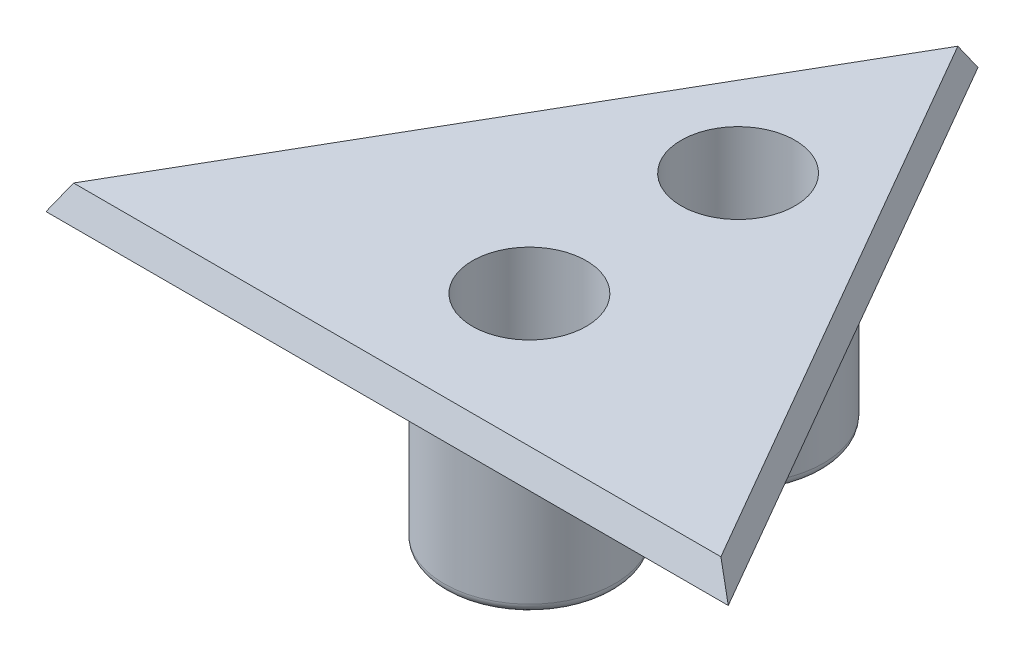
ISO-10303-21;
HEADER;
FILE_DESCRIPTION(('STEP AP214'),'2;1');
FILE_NAME('part.step','',(''),(''),'','','');
FILE_SCHEMA(('AUTOMOTIVE_DESIGN { 1 0 10303 214 1 1 1 1 }'));
ENDSEC;
DATA;
#1=APPLICATION_CONTEXT('core data for automotive mechanical design processes');
#2=APPLICATION_PROTOCOL_DEFINITION('international standard','automotive_design',2000,#1);
#3=PRODUCT_CONTEXT('',#1,'mechanical');
#4=PRODUCT('Part','Part','',(#3));
#5=PRODUCT_RELATED_PRODUCT_CATEGORY('part','',(#4));
#6=PRODUCT_DEFINITION_FORMATION('','',#4);
#7=PRODUCT_DEFINITION_CONTEXT('part definition',#1,'design');
#8=PRODUCT_DEFINITION('design','',#6,#7);
#9=PRODUCT_DEFINITION_SHAPE('','',#8);
#10=(LENGTH_UNIT() NAMED_UNIT(*) SI_UNIT(.MILLI.,.METRE.));
#11=(NAMED_UNIT(*) PLANE_ANGLE_UNIT() SI_UNIT($,.RADIAN.));
#12=(NAMED_UNIT(*) SI_UNIT($,.STERADIAN.) SOLID_ANGLE_UNIT());
#13=UNCERTAINTY_MEASURE_WITH_UNIT(LENGTH_MEASURE(1.E-05),#10,'distance_accuracy_value','');
#14=(GEOMETRIC_REPRESENTATION_CONTEXT(3) GLOBAL_UNCERTAINTY_ASSIGNED_CONTEXT((#13)) GLOBAL_UNIT_ASSIGNED_CONTEXT((#10,
#11,#12)) REPRESENTATION_CONTEXT('',''));
#15=CARTESIAN_POINT('',(0.,0.,0.));
#16=DIRECTION('',(0.,0.,1.));
#17=DIRECTION('',(1.,0.,0.));
#18=AXIS2_PLACEMENT_3D('',#15,#16,#17);
#19=CARTESIAN_POINT('',(35.9645,0.,20.7641137562707));
#20=DIRECTION('',(0.81635147794707,0.333806859233772,-0.471320745546087));
#21=DIRECTION('',(-0.499999999999998,0.,-0.86602540378444));
#22=AXIS2_PLACEMENT_3D('',#19,#20,#21);
#23=PLANE('',#22);
#24=DIRECTION('',(-0.499999999999998,0.,-0.86602540378444));
#25=VECTOR('',#24,1.);
#26=CARTESIAN_POINT('',(35.9645,0.,20.7641137562707));
#27=LINE('',#26,#25);
#28=CARTESIAN_POINT('',(35.9645,0.,20.7641137562707));
#29=VERTEX_POINT('',#28);
#30=CARTESIAN_POINT('',(0.,0.,-41.5282275125405));
#31=VERTEX_POINT('',#30);
#32=EDGE_CURVE('E72',#29,#31,#27,.T.);
#33=ORIENTED_EDGE('',*,*,#32,.T.);
#34=DIRECTION('',(0.,-0.81606150391628,-0.577965069728179));
#35=VECTOR('',#34,1.);
#36=CARTESIAN_POINT('',(0.,0.,-41.5282275125405));
#37=LINE('',#36,#35);
#38=CARTESIAN_POINT('',(0.,3.,-39.4035160773563));
#39=VERTEX_POINT('',#38);
#40=EDGE_CURVE('E78',#39,#31,#37,.T.);
#41=ORIENTED_EDGE('',*,*,#40,.F.);
#42=DIRECTION('',(0.499999999999998,0.,0.86602540378444));
#43=VECTOR('',#42,1.);
#44=CARTESIAN_POINT('',(35.0444729607096,3.,21.2952916150668));
#45=LINE('',#44,#43);
#46=CARTESIAN_POINT('',(34.1244459214192,3.,19.7017580386786));
#47=VERTEX_POINT('',#46);
#48=EDGE_CURVE('E94',#47,#39,#45,.F.);
#49=ORIENTED_EDGE('',*,*,#48,.F.);
#50=DIRECTION('',(0.500532432884646,-0.816061503916281,0.288982534864091));
#51=VECTOR('',#50,1.);
#52=CARTESIAN_POINT('',(35.9645,0.,20.7641137562707));
#53=LINE('',#52,#51);
#54=EDGE_CURVE('E86',#47,#29,#53,.T.);
#55=ORIENTED_EDGE('',*,*,#54,.T.);
#56=EDGE_LOOP('',(#33,#41,#49,#55));
#57=FACE_BOUND('',#56,.T.);
#58=ADVANCED_FACE('F34',(#57),#23,.T.);
#59=CARTESIAN_POINT('',(0.,0.,-41.5282275125405));
#60=DIRECTION('',(-0.81635147794707,0.333806859233772,-0.471320745546087));
#61=DIRECTION('',(-0.499999999999998,0.,0.86602540378444));
#62=AXIS2_PLACEMENT_3D('',#59,#60,#61);
#63=PLANE('',#62);
#64=DIRECTION('',(-0.499999999999998,0.,0.86602540378444));
#65=VECTOR('',#64,1.);
#66=CARTESIAN_POINT('',(0.,0.,-41.5282275125405));
#67=LINE('',#66,#65);
#68=CARTESIAN_POINT('',(-35.9644999999999,0.,20.7641137562704));
#69=VERTEX_POINT('',#68);
#70=EDGE_CURVE('E68',#31,#69,#67,.T.);
#71=ORIENTED_EDGE('',*,*,#70,.T.);
#72=DIRECTION('',(-0.500532432884645,-0.816061503916283,0.288982534864087));
#73=VECTOR('',#72,1.);
#74=CARTESIAN_POINT('',(-35.9644999999999,0.,20.7641137562704));
#75=LINE('',#74,#73);
#76=CARTESIAN_POINT('',(-34.1244459214191,3.,19.7017580386783));
#77=VERTEX_POINT('',#76);
#78=EDGE_CURVE('E83',#77,#69,#75,.T.);
#79=ORIENTED_EDGE('',*,*,#78,.F.);
#80=DIRECTION('',(0.499999999999998,0.,-0.86602540378444));
#81=VECTOR('',#80,1.);
#82=CARTESIAN_POINT('',(0.920027039290404,3.,-40.9970496537445));
#83=LINE('',#82,#81);
#84=EDGE_CURVE('E53',#39,#77,#83,.F.);
#85=ORIENTED_EDGE('',*,*,#84,.F.);
#86=ORIENTED_EDGE('',*,*,#40,.T.);
#87=EDGE_LOOP('',(#71,#79,#85,#86));
#88=FACE_BOUND('',#87,.T.);
#89=ADVANCED_FACE('F79',(#88),#63,.T.);
#90=CARTESIAN_POINT('',(-35.9644999999999,0.,20.7641137562704));
#91=DIRECTION('',(0.,0.333806859233772,0.942641491092178));
#92=DIRECTION('',(0.,-0.942641491092178,0.333806859233772));
#93=AXIS2_PLACEMENT_3D('',#90,#91,#92);
#94=PLANE('',#93);
#95=DIRECTION('',(1.,0.,0.));
#96=VECTOR('',#95,1.);
#97=CARTESIAN_POINT('',(-35.9644999999999,0.,20.7641137562704));
#98=LINE('',#97,#96);
#99=EDGE_CURVE('E73',#69,#29,#98,.T.);
#100=ORIENTED_EDGE('',*,*,#99,.T.);
#101=ORIENTED_EDGE('',*,*,#54,.F.);
#102=DIRECTION('',(-1.,0.,0.));
#103=VECTOR('',#102,1.);
#104=CARTESIAN_POINT('',(-35.9644999999998,3.,19.7017580386783));
#105=LINE('',#104,#103);
#106=EDGE_CURVE('E49',#77,#47,#105,.F.);
#107=ORIENTED_EDGE('',*,*,#106,.F.);
#108=ORIENTED_EDGE('',*,*,#78,.T.);
#109=EDGE_LOOP('',(#100,#101,#107,#108));
#110=FACE_BOUND('',#109,.T.);
#111=ADVANCED_FACE('F145',(#110),#94,.T.);
#112=CARTESIAN_POINT('',(0.,3.,0.));
#113=DIRECTION('',(0.,1.,0.));
#114=DIRECTION('',(0.,0.,1.));
#115=AXIS2_PLACEMENT_3D('',#112,#113,#114);
#116=PLANE('',#115);
#117=CARTESIAN_POINT('',(0.,3.,5.76411375627044));
#118=DIRECTION('',(0.,1.,0.));
#119=DIRECTION('',(0.,0.,1.));
#120=AXIS2_PLACEMENT_3D('',#117,#118,#119);
#121=CIRCLE('',#120,6.);
#122=CARTESIAN_POINT('',(0.,3.,11.7641137562704));
#123=VERTEX_POINT('',#122);
#124=EDGE_CURVE('E120',#123,#123,#121,.T.);
#125=ORIENTED_EDGE('',*,*,#124,.F.);
#126=EDGE_LOOP('',(#125));
#127=FACE_BOUND('',#126,.T.);
#128=CARTESIAN_POINT('',(0.,3.,-16.2358862437296));
#129=DIRECTION('',(0.,1.,0.));
#130=DIRECTION('',(0.,0.,1.));
#131=AXIS2_PLACEMENT_3D('',#128,#129,#130);
#132=CIRCLE('',#131,6.);
#133=CARTESIAN_POINT('',(0.,3.,-10.2358862437296));
#134=VERTEX_POINT('',#133);
#135=EDGE_CURVE('E90',#134,#134,#132,.T.);
#136=ORIENTED_EDGE('',*,*,#135,.F.);
#137=EDGE_LOOP('',(#136));
#138=FACE_BOUND('',#137,.T.);
#139=ORIENTED_EDGE('',*,*,#48,.T.);
#140=ORIENTED_EDGE('',*,*,#84,.T.);
#141=ORIENTED_EDGE('',*,*,#106,.T.);
#142=EDGE_LOOP('',(#139,#140,#141));
#143=FACE_BOUND('',#142,.T.);
#144=ADVANCED_FACE('F151',(#127,#138,#143),#116,.T.);
#145=CARTESIAN_POINT('',(0.,0.,0.));
#146=DIRECTION('',(0.,1.,0.));
#147=DIRECTION('',(0.,0.,1.));
#148=AXIS2_PLACEMENT_3D('',#145,#146,#147);
#149=PLANE('',#148);
#150=CARTESIAN_POINT('',(0.,0.,5.76411375627044));
#151=DIRECTION('',(0.,1.,0.));
#152=DIRECTION('',(0.,0.,1.));
#153=AXIS2_PLACEMENT_3D('',#150,#151,#152);
#154=CIRCLE('',#153,9.5);
#155=CARTESIAN_POINT('',(0.,0.,15.2641137562704));
#156=VERTEX_POINT('',#155);
#157=EDGE_CURVE('E42',#156,#156,#154,.T.);
#158=ORIENTED_EDGE('',*,*,#157,.T.);
#159=EDGE_LOOP('',(#158));
#160=FACE_BOUND('',#159,.T.);
#161=CARTESIAN_POINT('',(0.,0.,-16.2358862437296));
#162=DIRECTION('',(0.,1.,0.));
#163=DIRECTION('',(0.,0.,1.));
#164=AXIS2_PLACEMENT_3D('',#161,#162,#163);
#165=CIRCLE('',#164,9.5);
#166=CARTESIAN_POINT('',(0.,0.,-6.73588624372956));
#167=VERTEX_POINT('',#166);
#168=EDGE_CURVE('E110',#167,#167,#165,.T.);
#169=ORIENTED_EDGE('',*,*,#168,.T.);
#170=EDGE_LOOP('',(#169));
#171=FACE_BOUND('',#170,.T.);
#172=ORIENTED_EDGE('',*,*,#32,.F.);
#173=ORIENTED_EDGE('',*,*,#99,.F.);
#174=ORIENTED_EDGE('',*,*,#70,.F.);
#175=EDGE_LOOP('',(#172,#173,#174));
#176=FACE_BOUND('',#175,.T.);
#177=ADVANCED_FACE('F70',(#160,#171,#176),#149,.F.);
#178=CARTESIAN_POINT('',(0.,-20.,-16.2358862437296));
#179=DIRECTION('',(0.,1.,0.));
#180=DIRECTION('',(0.,0.,1.));
#181=AXIS2_PLACEMENT_3D('',#178,#179,#180);
#182=CYLINDRICAL_SURFACE('',#181,9.);
#183=CARTESIAN_POINT('',(0.,-0.5,-16.2358862437296));
#184=DIRECTION('',(0.,1.,0.));
#185=DIRECTION('',(0.,0.,1.));
#186=AXIS2_PLACEMENT_3D('',#183,#184,#185);
#187=CIRCLE('',#186,9.);
#188=CARTESIAN_POINT('',(0.,-0.5,-7.23588624372956));
#189=VERTEX_POINT('',#188);
#190=EDGE_CURVE('E113',#189,#189,#187,.F.);
#191=ORIENTED_EDGE('',*,*,#190,.T.);
#192=EDGE_LOOP('',(#191));
#193=FACE_BOUND('',#192,.T.);
#194=CARTESIAN_POINT('',(0.,-19.,-16.2358862437296));
#195=DIRECTION('',(0.,1.,0.));
#196=DIRECTION('',(0.,0.,1.));
#197=AXIS2_PLACEMENT_3D('',#194,#195,#196);
#198=CIRCLE('',#197,9.);
#199=CARTESIAN_POINT('',(0.,-19.,-7.23588624372956));
#200=VERTEX_POINT('',#199);
#201=EDGE_CURVE('E82',#200,#200,#198,.T.);
#202=ORIENTED_EDGE('',*,*,#201,.T.);
#203=EDGE_LOOP('',(#202));
#204=FACE_BOUND('',#203,.T.);
#205=ADVANCED_FACE('F173',(#193,#204),#182,.T.);
#206=CARTESIAN_POINT('',(0.,-20.,-16.2358862437296));
#207=DIRECTION('',(0.,1.,0.));
#208=DIRECTION('',(0.,0.,1.));
#209=AXIS2_PLACEMENT_3D('',#206,#207,#208);
#210=PLANE('',#209);
#211=CARTESIAN_POINT('',(0.,-20.,-16.2358862437296));
#212=DIRECTION('',(0.,1.,0.));
#213=DIRECTION('',(0.,0.,1.));
#214=AXIS2_PLACEMENT_3D('',#211,#212,#213);
#215=CIRCLE('',#214,8.);
#216=CARTESIAN_POINT('',(0.,-20.,-8.23588624372956));
#217=VERTEX_POINT('',#216);
#218=EDGE_CURVE('E107',#217,#217,#215,.F.);
#219=ORIENTED_EDGE('',*,*,#218,.T.);
#220=EDGE_LOOP('',(#219));
#221=FACE_BOUND('',#220,.T.);
#222=CARTESIAN_POINT('',(0.,-20.,-16.2358862437296));
#223=DIRECTION('',(0.,-1.,0.));
#224=DIRECTION('',(0.,0.,-1.));
#225=AXIS2_PLACEMENT_3D('',#222,#223,#224);
#226=CIRCLE('',#225,5.1);
#227=CARTESIAN_POINT('',(0.,-20.,-21.3358862437296));
#228=VERTEX_POINT('',#227);
#229=EDGE_CURVE('E104',#228,#228,#226,.T.);
#230=ORIENTED_EDGE('',*,*,#229,.F.);
#231=EDGE_LOOP('',(#230));
#232=FACE_BOUND('',#231,.T.);
#233=ADVANCED_FACE('F178',(#221,#232),#210,.F.);
#234=CARTESIAN_POINT('',(0.,-7.,-16.2358862437296));
#235=DIRECTION('',(0.,1.,0.));
#236=DIRECTION('',(0.,0.,1.));
#237=AXIS2_PLACEMENT_3D('',#234,#235,#236);
#238=CYLINDRICAL_SURFACE('',#237,6.);
#239=CARTESIAN_POINT('',(0.,-7.,-16.2358862437296));
#240=DIRECTION('',(0.,1.,0.));
#241=DIRECTION('',(0.,0.,1.));
#242=AXIS2_PLACEMENT_3D('',#239,#240,#241);
#243=CIRCLE('',#242,6.);
#244=CARTESIAN_POINT('',(0.,-7.,-10.2358862437296));
#245=VERTEX_POINT('',#244);
#246=EDGE_CURVE('E87',#245,#245,#243,.T.);
#247=ORIENTED_EDGE('',*,*,#246,.F.);
#248=EDGE_LOOP('',(#247));
#249=FACE_BOUND('',#248,.T.);
#250=ORIENTED_EDGE('',*,*,#135,.T.);
#251=EDGE_LOOP('',(#250));
#252=FACE_BOUND('',#251,.T.);
#253=ADVANCED_FACE('F189',(#249,#252),#238,.F.);
#254=CARTESIAN_POINT('',(0.,-7.,-16.2358862437296));
#255=DIRECTION('',(0.,1.,0.));
#256=DIRECTION('',(0.,0.,1.));
#257=AXIS2_PLACEMENT_3D('',#254,#255,#256);
#258=PLANE('',#257);
#259=CARTESIAN_POINT('',(0.,-7.,-16.2358862437296));
#260=DIRECTION('',(0.,1.,0.));
#261=DIRECTION('',(0.,0.,1.));
#262=AXIS2_PLACEMENT_3D('',#259,#260,#261);
#263=CIRCLE('',#262,5.1);
#264=CARTESIAN_POINT('',(0.,-7.,-11.1358862437296));
#265=VERTEX_POINT('',#264);
#266=EDGE_CURVE('E101',#265,#265,#263,.T.);
#267=ORIENTED_EDGE('',*,*,#266,.F.);
#268=EDGE_LOOP('',(#267));
#269=FACE_BOUND('',#268,.T.);
#270=ORIENTED_EDGE('',*,*,#246,.T.);
#271=EDGE_LOOP('',(#270));
#272=FACE_BOUND('',#271,.T.);
#273=ADVANCED_FACE('F193',(#269,#272),#258,.T.);
#274=CARTESIAN_POINT('',(0.,-20.,-16.2358862437296));
#275=DIRECTION('',(0.,-1.,0.));
#276=DIRECTION('',(0.,0.,-1.));
#277=AXIS2_PLACEMENT_3D('',#274,#275,#276);
#278=CYLINDRICAL_SURFACE('',#277,5.1);
#279=ORIENTED_EDGE('',*,*,#266,.T.);
#280=EDGE_LOOP('',(#279));
#281=FACE_BOUND('',#280,.T.);
#282=ORIENTED_EDGE('',*,*,#229,.T.);
#283=EDGE_LOOP('',(#282));
#284=FACE_BOUND('',#283,.T.);
#285=ADVANCED_FACE('F158',(#281,#284),#278,.F.);
#286=CARTESIAN_POINT('',(0.,-19.,-16.2358862437296));
#287=DIRECTION('',(0.,1.,0.));
#288=DIRECTION('',(0.,0.,1.));
#289=AXIS2_PLACEMENT_3D('',#286,#287,#288);
#290=TOROIDAL_SURFACE('',#289,8.,1.);
#291=ORIENTED_EDGE('',*,*,#218,.F.);
#292=EDGE_LOOP('',(#291));
#293=FACE_BOUND('',#292,.T.);
#294=ORIENTED_EDGE('',*,*,#201,.F.);
#295=EDGE_LOOP('',(#294));
#296=FACE_BOUND('',#295,.T.);
#297=ADVANCED_FACE('F154',(#293,#296),#290,.T.);
#298=CARTESIAN_POINT('',(0.,-0.5,-16.2358862437296));
#299=DIRECTION('',(0.,1.,0.));
#300=DIRECTION('',(0.,0.,1.));
#301=AXIS2_PLACEMENT_3D('',#298,#299,#300);
#302=TOROIDAL_SURFACE('',#301,9.5,0.5);
#303=ORIENTED_EDGE('',*,*,#190,.F.);
#304=EDGE_LOOP('',(#303));
#305=FACE_BOUND('',#304,.T.);
#306=ORIENTED_EDGE('',*,*,#168,.F.);
#307=EDGE_LOOP('',(#306));
#308=FACE_BOUND('',#307,.T.);
#309=ADVANCED_FACE('F157',(#305,#308),#302,.F.);
#310=CARTESIAN_POINT('',(0.,-20.,5.76411375627044));
#311=DIRECTION('',(0.,1.,0.));
#312=DIRECTION('',(0.,0.,1.));
#313=AXIS2_PLACEMENT_3D('',#310,#311,#312);
#314=CYLINDRICAL_SURFACE('',#313,9.);
#315=CARTESIAN_POINT('',(0.,-0.5,5.76411375627044));
#316=DIRECTION('',(0.,1.,0.));
#317=DIRECTION('',(0.,0.,1.));
#318=AXIS2_PLACEMENT_3D('',#315,#316,#317);
#319=CIRCLE('',#318,9.);
#320=CARTESIAN_POINT('',(0.,-0.5,14.7641137562704));
#321=VERTEX_POINT('',#320);
#322=EDGE_CURVE('E11',#321,#321,#319,.F.);
#323=ORIENTED_EDGE('',*,*,#322,.T.);
#324=EDGE_LOOP('',(#323));
#325=FACE_BOUND('',#324,.T.);
#326=CARTESIAN_POINT('',(0.,-19.,5.76411375627044));
#327=DIRECTION('',(0.,1.,0.));
#328=DIRECTION('',(0.,0.,1.));
#329=AXIS2_PLACEMENT_3D('',#326,#327,#328);
#330=CIRCLE('',#329,9.);
#331=CARTESIAN_POINT('',(0.,-19.,14.7641137562704));
#332=VERTEX_POINT('',#331);
#333=EDGE_CURVE('E116',#332,#332,#330,.T.);
#334=ORIENTED_EDGE('',*,*,#333,.T.);
#335=EDGE_LOOP('',(#334));
#336=FACE_BOUND('',#335,.T.);
#337=ADVANCED_FACE('F161',(#325,#336),#314,.T.);
#338=CARTESIAN_POINT('',(0.,-20.,5.76411375627044));
#339=DIRECTION('',(0.,1.,0.));
#340=DIRECTION('',(0.,0.,1.));
#341=AXIS2_PLACEMENT_3D('',#338,#339,#340);
#342=PLANE('',#341);
#343=CARTESIAN_POINT('',(0.,-20.,5.76411375627044));
#344=DIRECTION('',(0.,1.,0.));
#345=DIRECTION('',(0.,0.,1.));
#346=AXIS2_PLACEMENT_3D('',#343,#344,#345);
#347=CIRCLE('',#346,8.);
#348=CARTESIAN_POINT('',(0.,-20.,13.7641137562704));
#349=VERTEX_POINT('',#348);
#350=EDGE_CURVE('E124',#349,#349,#347,.F.);
#351=ORIENTED_EDGE('',*,*,#350,.T.);
#352=EDGE_LOOP('',(#351));
#353=FACE_BOUND('',#352,.T.);
#354=CARTESIAN_POINT('',(0.,-20.,5.76411375627044));
#355=DIRECTION('',(0.,-1.,0.));
#356=DIRECTION('',(0.,0.,-1.));
#357=AXIS2_PLACEMENT_3D('',#354,#355,#356);
#358=CIRCLE('',#357,5.1);
#359=CARTESIAN_POINT('',(0.,-20.,0.664113756270437));
#360=VERTEX_POINT('',#359);
#361=EDGE_CURVE('E121',#360,#360,#358,.T.);
#362=ORIENTED_EDGE('',*,*,#361,.F.);
#363=EDGE_LOOP('',(#362));
#364=FACE_BOUND('',#363,.T.);
#365=ADVANCED_FACE('F166',(#353,#364),#342,.F.);
#366=CARTESIAN_POINT('',(0.,-7.,5.76411375627044));
#367=DIRECTION('',(0.,1.,0.));
#368=DIRECTION('',(0.,0.,1.));
#369=AXIS2_PLACEMENT_3D('',#366,#367,#368);
#370=CYLINDRICAL_SURFACE('',#369,6.);
#371=CARTESIAN_POINT('',(0.,-7.,5.76411375627044));
#372=DIRECTION('',(0.,1.,0.));
#373=DIRECTION('',(0.,0.,1.));
#374=AXIS2_PLACEMENT_3D('',#371,#372,#373);
#375=CIRCLE('',#374,6.);
#376=CARTESIAN_POINT('',(0.,-7.,11.7641137562704));
#377=VERTEX_POINT('',#376);
#378=EDGE_CURVE('E223',#377,#377,#375,.T.);
#379=ORIENTED_EDGE('',*,*,#378,.F.);
#380=EDGE_LOOP('',(#379));
#381=FACE_BOUND('',#380,.T.);
#382=ORIENTED_EDGE('',*,*,#124,.T.);
#383=EDGE_LOOP('',(#382));
#384=FACE_BOUND('',#383,.T.);
#385=ADVANCED_FACE('F203',(#381,#384),#370,.F.);
#386=CARTESIAN_POINT('',(0.,-7.,5.76411375627044));
#387=DIRECTION('',(0.,1.,0.));
#388=DIRECTION('',(0.,0.,1.));
#389=AXIS2_PLACEMENT_3D('',#386,#387,#388);
#390=PLANE('',#389);
#391=CARTESIAN_POINT('',(0.,-7.,5.76411375627044));
#392=DIRECTION('',(0.,1.,0.));
#393=DIRECTION('',(0.,0.,1.));
#394=AXIS2_PLACEMENT_3D('',#391,#392,#393);
#395=CIRCLE('',#394,5.1);
#396=CARTESIAN_POINT('',(0.,-7.,10.8641137562704));
#397=VERTEX_POINT('',#396);
#398=EDGE_CURVE('E117',#397,#397,#395,.T.);
#399=ORIENTED_EDGE('',*,*,#398,.F.);
#400=EDGE_LOOP('',(#399));
#401=FACE_BOUND('',#400,.T.);
#402=ORIENTED_EDGE('',*,*,#378,.T.);
#403=EDGE_LOOP('',(#402));
#404=FACE_BOUND('',#403,.T.);
#405=ADVANCED_FACE('F207',(#401,#404),#390,.T.);
#406=CARTESIAN_POINT('',(0.,-20.,5.76411375627044));
#407=DIRECTION('',(0.,-1.,0.));
#408=DIRECTION('',(0.,0.,-1.));
#409=AXIS2_PLACEMENT_3D('',#406,#407,#408);
#410=CYLINDRICAL_SURFACE('',#409,5.1);
#411=ORIENTED_EDGE('',*,*,#398,.T.);
#412=EDGE_LOOP('',(#411));
#413=FACE_BOUND('',#412,.T.);
#414=ORIENTED_EDGE('',*,*,#361,.T.);
#415=EDGE_LOOP('',(#414));
#416=FACE_BOUND('',#415,.T.);
#417=ADVANCED_FACE('F137',(#413,#416),#410,.F.);
#418=CARTESIAN_POINT('',(0.,-19.,5.76411375627044));
#419=DIRECTION('',(0.,1.,0.));
#420=DIRECTION('',(0.,0.,1.));
#421=AXIS2_PLACEMENT_3D('',#418,#419,#420);
#422=TOROIDAL_SURFACE('',#421,8.,1.);
#423=ORIENTED_EDGE('',*,*,#350,.F.);
#424=EDGE_LOOP('',(#423));
#425=FACE_BOUND('',#424,.T.);
#426=ORIENTED_EDGE('',*,*,#333,.F.);
#427=EDGE_LOOP('',(#426));
#428=FACE_BOUND('',#427,.T.);
#429=ADVANCED_FACE('F132',(#425,#428),#422,.T.);
#430=CARTESIAN_POINT('',(0.,-0.5,5.76411375627044));
#431=DIRECTION('',(0.,1.,0.));
#432=DIRECTION('',(0.,0.,1.));
#433=AXIS2_PLACEMENT_3D('',#430,#431,#432);
#434=TOROIDAL_SURFACE('',#433,9.5,0.5);
#435=ORIENTED_EDGE('',*,*,#322,.F.);
#436=EDGE_LOOP('',(#435));
#437=FACE_BOUND('',#436,.T.);
#438=ORIENTED_EDGE('',*,*,#157,.F.);
#439=EDGE_LOOP('',(#438));
#440=FACE_BOUND('',#439,.T.);
#441=ADVANCED_FACE('F36',(#437,#440),#434,.F.);
#442=CLOSED_SHELL('',(#58,#89,#111,#144,#177,#205,#233,#253,#273,#285,#297,#309,#337,#365,#385,
#405,#417,#429,#441));
#443=MANIFOLD_SOLID_BREP('B2',#442);
#444=ADVANCED_BREP_SHAPE_REPRESENTATION('',(#18,#443),#14);
#445=SHAPE_DEFINITION_REPRESENTATION(#9,#444);
ENDSEC;
END-ISO-10303-21;
